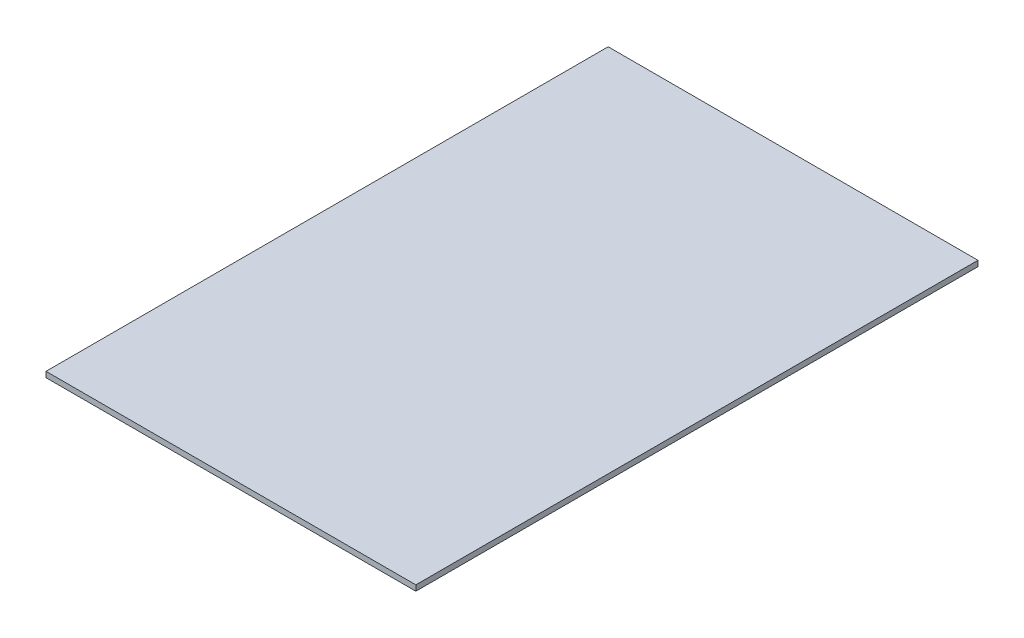
ISO-10303-21;
HEADER;
FILE_DESCRIPTION(('STEP AP214'),'2;1');
FILE_NAME('part.step','',(''),(''),'','','');
FILE_SCHEMA(('AUTOMOTIVE_DESIGN { 1 0 10303 214 1 1 1 1 }'));
ENDSEC;
DATA;
#1=APPLICATION_CONTEXT('core data for automotive mechanical design processes');
#2=APPLICATION_PROTOCOL_DEFINITION('international standard','automotive_design',2000,#1);
#3=PRODUCT_CONTEXT('',#1,'mechanical');
#4=PRODUCT('Part','Part','',(#3));
#5=PRODUCT_RELATED_PRODUCT_CATEGORY('part','',(#4));
#6=PRODUCT_DEFINITION_FORMATION('','',#4);
#7=PRODUCT_DEFINITION_CONTEXT('part definition',#1,'design');
#8=PRODUCT_DEFINITION('design','',#6,#7);
#9=PRODUCT_DEFINITION_SHAPE('','',#8);
#10=(LENGTH_UNIT() NAMED_UNIT(*) SI_UNIT(.MILLI.,.METRE.));
#11=(NAMED_UNIT(*) PLANE_ANGLE_UNIT() SI_UNIT($,.RADIAN.));
#12=(NAMED_UNIT(*) SI_UNIT($,.STERADIAN.) SOLID_ANGLE_UNIT());
#13=UNCERTAINTY_MEASURE_WITH_UNIT(LENGTH_MEASURE(1.E-05),#10,'distance_accuracy_value','');
#14=(GEOMETRIC_REPRESENTATION_CONTEXT(3) GLOBAL_UNCERTAINTY_ASSIGNED_CONTEXT((#13)) GLOBAL_UNIT_ASSIGNED_CONTEXT((#10,
#11,#12)) REPRESENTATION_CONTEXT('',''));
#15=CARTESIAN_POINT('',(0.,0.,0.));
#16=DIRECTION('',(0.,0.,1.));
#17=DIRECTION('',(1.,0.,0.));
#18=AXIS2_PLACEMENT_3D('',#15,#16,#17);
#19=CARTESIAN_POINT('',(0.,3.,0.));
#20=DIRECTION('',(1.,0.,0.));
#21=DIRECTION('',(0.,0.,-1.));
#22=AXIS2_PLACEMENT_3D('',#19,#20,#21);
#23=PLANE('',#22);
#24=DIRECTION('',(0.,0.,1.));
#25=VECTOR('',#24,1.);
#26=CARTESIAN_POINT('',(0.,0.,0.));
#27=LINE('',#26,#25);
#28=CARTESIAN_POINT('',(0.,0.,0.));
#29=VERTEX_POINT('',#28);
#30=CARTESIAN_POINT('',(0.,0.,304.));
#31=VERTEX_POINT('',#30);
#32=EDGE_CURVE('E119',#29,#31,#27,.T.);
#33=ORIENTED_EDGE('',*,*,#32,.T.);
#34=DIRECTION('',(0.,-1.,0.));
#35=VECTOR('',#34,1.);
#36=CARTESIAN_POINT('',(0.,3.,304.));
#37=LINE('',#36,#35);
#38=CARTESIAN_POINT('',(0.,3.,304.));
#39=VERTEX_POINT('',#38);
#40=EDGE_CURVE('E11',#39,#31,#37,.T.);
#41=ORIENTED_EDGE('',*,*,#40,.F.);
#42=DIRECTION('',(0.,0.,1.));
#43=VECTOR('',#42,1.);
#44=CARTESIAN_POINT('',(0.,3.,0.));
#45=LINE('',#44,#43);
#46=CARTESIAN_POINT('',(0.,3.,0.));
#47=VERTEX_POINT('',#46);
#48=EDGE_CURVE('E103',#47,#39,#45,.T.);
#49=ORIENTED_EDGE('',*,*,#48,.F.);
#50=DIRECTION('',(0.,-1.,0.));
#51=VECTOR('',#50,1.);
#52=CARTESIAN_POINT('',(0.,3.,0.));
#53=LINE('',#52,#51);
#54=EDGE_CURVE('E115',#47,#29,#53,.T.);
#55=ORIENTED_EDGE('',*,*,#54,.T.);
#56=EDGE_LOOP('',(#33,#41,#49,#55));
#57=FACE_BOUND('',#56,.T.);
#58=ADVANCED_FACE('F51',(#57),#23,.F.);
#59=CARTESIAN_POINT('',(0.,3.,304.));
#60=DIRECTION('',(0.,0.,-1.));
#61=DIRECTION('',(-1.,0.,0.));
#62=AXIS2_PLACEMENT_3D('',#59,#60,#61);
#63=PLANE('',#62);
#64=DIRECTION('',(1.,0.,0.));
#65=VECTOR('',#64,1.);
#66=CARTESIAN_POINT('',(0.,0.,304.));
#67=LINE('',#66,#65);
#68=CARTESIAN_POINT('',(200.,0.,304.));
#69=VERTEX_POINT('',#68);
#70=EDGE_CURVE('E108',#31,#69,#67,.T.);
#71=ORIENTED_EDGE('',*,*,#70,.T.);
#72=DIRECTION('',(0.,-1.,0.));
#73=VECTOR('',#72,1.);
#74=CARTESIAN_POINT('',(200.,3.,304.));
#75=LINE('',#74,#73);
#76=CARTESIAN_POINT('',(200.,3.,304.));
#77=VERTEX_POINT('',#76);
#78=EDGE_CURVE('E60',#77,#69,#75,.T.);
#79=ORIENTED_EDGE('',*,*,#78,.F.);
#80=DIRECTION('',(1.,0.,0.));
#81=VECTOR('',#80,1.);
#82=CARTESIAN_POINT('',(0.,3.,304.));
#83=LINE('',#82,#81);
#84=EDGE_CURVE('E98',#39,#77,#83,.T.);
#85=ORIENTED_EDGE('',*,*,#84,.F.);
#86=ORIENTED_EDGE('',*,*,#40,.T.);
#87=EDGE_LOOP('',(#71,#79,#85,#86));
#88=FACE_BOUND('',#87,.T.);
#89=ADVANCED_FACE('F107',(#88),#63,.F.);
#90=CARTESIAN_POINT('',(200.,3.,0.));
#91=DIRECTION('',(-1.,0.,0.));
#92=DIRECTION('',(0.,0.,1.));
#93=AXIS2_PLACEMENT_3D('',#90,#91,#92);
#94=PLANE('',#93);
#95=DIRECTION('',(0.,0.,-1.));
#96=VECTOR('',#95,1.);
#97=CARTESIAN_POINT('',(200.,0.,0.));
#98=LINE('',#97,#96);
#99=CARTESIAN_POINT('',(200.,0.,0.));
#100=VERTEX_POINT('',#99);
#101=EDGE_CURVE('E85',#69,#100,#98,.T.);
#102=ORIENTED_EDGE('',*,*,#101,.T.);
#103=DIRECTION('',(0.,-1.,0.));
#104=VECTOR('',#103,1.);
#105=CARTESIAN_POINT('',(200.,3.,0.));
#106=LINE('',#105,#104);
#107=CARTESIAN_POINT('',(200.,3.,0.));
#108=VERTEX_POINT('',#107);
#109=EDGE_CURVE('E110',#108,#100,#106,.T.);
#110=ORIENTED_EDGE('',*,*,#109,.F.);
#111=DIRECTION('',(0.,0.,-1.));
#112=VECTOR('',#111,1.);
#113=CARTESIAN_POINT('',(200.,3.,0.));
#114=LINE('',#113,#112);
#115=EDGE_CURVE('E101',#77,#108,#114,.T.);
#116=ORIENTED_EDGE('',*,*,#115,.F.);
#117=ORIENTED_EDGE('',*,*,#78,.T.);
#118=EDGE_LOOP('',(#102,#110,#116,#117));
#119=FACE_BOUND('',#118,.T.);
#120=ADVANCED_FACE('F111',(#119),#94,.F.);
#121=CARTESIAN_POINT('',(0.,3.,0.));
#122=DIRECTION('',(0.,0.,1.));
#123=DIRECTION('',(1.,0.,0.));
#124=AXIS2_PLACEMENT_3D('',#121,#122,#123);
#125=PLANE('',#124);
#126=DIRECTION('',(-1.,0.,0.));
#127=VECTOR('',#126,1.);
#128=CARTESIAN_POINT('',(0.,0.,0.));
#129=LINE('',#128,#127);
#130=EDGE_CURVE('E91',#100,#29,#129,.T.);
#131=ORIENTED_EDGE('',*,*,#130,.T.);
#132=ORIENTED_EDGE('',*,*,#54,.F.);
#133=DIRECTION('',(-1.,0.,0.));
#134=VECTOR('',#133,1.);
#135=CARTESIAN_POINT('',(0.,3.,0.));
#136=LINE('',#135,#134);
#137=EDGE_CURVE('E68',#108,#47,#136,.T.);
#138=ORIENTED_EDGE('',*,*,#137,.F.);
#139=ORIENTED_EDGE('',*,*,#109,.T.);
#140=EDGE_LOOP('',(#131,#132,#138,#139));
#141=FACE_BOUND('',#140,.T.);
#142=ADVANCED_FACE('F132',(#141),#125,.F.);
#143=CARTESIAN_POINT('',(0.,3.,0.));
#144=DIRECTION('',(0.,1.,0.));
#145=DIRECTION('',(0.,0.,1.));
#146=AXIS2_PLACEMENT_3D('',#143,#144,#145);
#147=PLANE('',#146);
#148=ORIENTED_EDGE('',*,*,#48,.T.);
#149=ORIENTED_EDGE('',*,*,#84,.T.);
#150=ORIENTED_EDGE('',*,*,#115,.T.);
#151=ORIENTED_EDGE('',*,*,#137,.T.);
#152=EDGE_LOOP('',(#148,#149,#150,#151));
#153=FACE_BOUND('',#152,.T.);
#154=ADVANCED_FACE('F99',(#153),#147,.T.);
#155=CARTESIAN_POINT('',(0.,0.,0.));
#156=DIRECTION('',(0.,1.,0.));
#157=DIRECTION('',(0.,0.,1.));
#158=AXIS2_PLACEMENT_3D('',#155,#156,#157);
#159=PLANE('',#158);
#160=ORIENTED_EDGE('',*,*,#32,.F.);
#161=ORIENTED_EDGE('',*,*,#130,.F.);
#162=ORIENTED_EDGE('',*,*,#101,.F.);
#163=ORIENTED_EDGE('',*,*,#70,.F.);
#164=EDGE_LOOP('',(#160,#161,#162,#163));
#165=FACE_BOUND('',#164,.T.);
#166=ADVANCED_FACE('F135',(#165),#159,.F.);
#167=CLOSED_SHELL('',(#58,#89,#120,#142,#154,#166));
#168=MANIFOLD_SOLID_BREP('B2',#167);
#169=ADVANCED_BREP_SHAPE_REPRESENTATION('',(#18,#168),#14);
#170=SHAPE_DEFINITION_REPRESENTATION(#9,#169);
ENDSEC;
END-ISO-10303-21;
